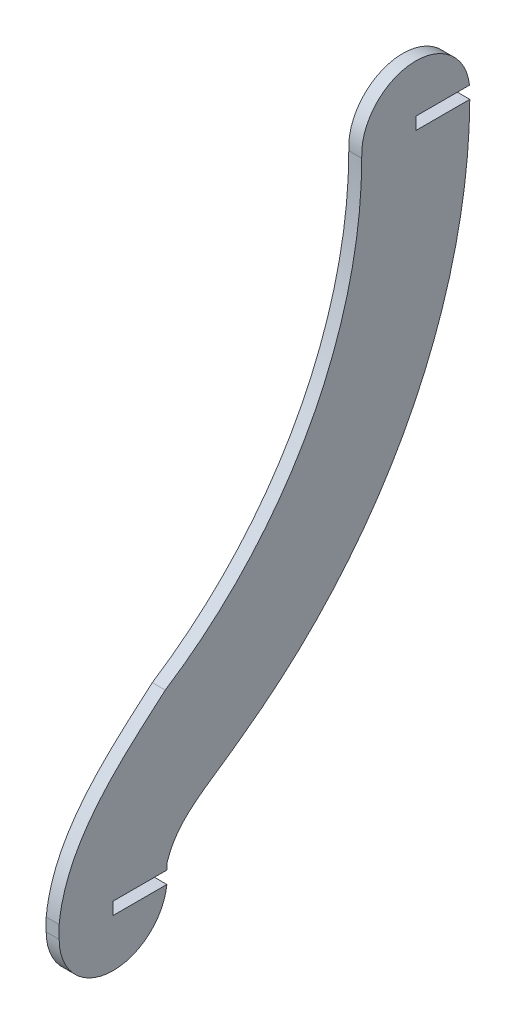
ISO-10303-21;
HEADER;
FILE_DESCRIPTION(('STEP AP214'),'2;1');
FILE_NAME('part.step','',(''),(''),'','','');
FILE_SCHEMA(('AUTOMOTIVE_DESIGN { 1 0 10303 214 1 1 1 1 }'));
ENDSEC;
DATA;
#1=APPLICATION_CONTEXT('core data for automotive mechanical design processes');
#2=APPLICATION_PROTOCOL_DEFINITION('international standard','automotive_design',2000,#1);
#3=PRODUCT_CONTEXT('',#1,'mechanical');
#4=PRODUCT('Part','Part','',(#3));
#5=PRODUCT_RELATED_PRODUCT_CATEGORY('part','',(#4));
#6=PRODUCT_DEFINITION_FORMATION('','',#4);
#7=PRODUCT_DEFINITION_CONTEXT('part definition',#1,'design');
#8=PRODUCT_DEFINITION('design','',#6,#7);
#9=PRODUCT_DEFINITION_SHAPE('','',#8);
#10=(LENGTH_UNIT() NAMED_UNIT(*) SI_UNIT(.MILLI.,.METRE.));
#11=(NAMED_UNIT(*) PLANE_ANGLE_UNIT() SI_UNIT($,.RADIAN.));
#12=(NAMED_UNIT(*) SI_UNIT($,.STERADIAN.) SOLID_ANGLE_UNIT());
#13=UNCERTAINTY_MEASURE_WITH_UNIT(LENGTH_MEASURE(1.E-05),#10,'distance_accuracy_value','');
#14=(GEOMETRIC_REPRESENTATION_CONTEXT(3) GLOBAL_UNCERTAINTY_ASSIGNED_CONTEXT((#13)) GLOBAL_UNIT_ASSIGNED_CONTEXT((#10,
#11,#12)) REPRESENTATION_CONTEXT('',''));
#15=CARTESIAN_POINT('',(0.,0.,0.));
#16=DIRECTION('',(0.,0.,1.));
#17=DIRECTION('',(1.,0.,0.));
#18=AXIS2_PLACEMENT_3D('',#15,#16,#17);
#19=CARTESIAN_POINT('',(3.,0.75,-112.5));
#20=DIRECTION('',(-1.,0.,0.));
#21=DIRECTION('',(0.,0.,1.));
#22=AXIS2_PLACEMENT_3D('',#19,#20,#21);
#23=CYLINDRICAL_SURFACE('',#22,12.5224797863682);
#24=CARTESIAN_POINT('',(3.,0.75,-112.5));
#25=DIRECTION('',(1.,0.,0.));
#26=DIRECTION('',(0.,0.,1.));
#27=AXIS2_PLACEMENT_3D('',#24,#25,#26);
#28=CIRCLE('',#27,12.5224797863682);
#29=CARTESIAN_POINT('',(3.,2.185,-124.939986937292));
#30=VERTEX_POINT('',#29);
#31=CARTESIAN_POINT('',(3.,0.,-100.));
#32=VERTEX_POINT('',#31);
#33=EDGE_CURVE('E189',#30,#32,#28,.T.);
#34=ORIENTED_EDGE('',*,*,#33,.F.);
#35=DIRECTION('',(-1.,0.,0.));
#36=VECTOR('',#35,1.);
#37=CARTESIAN_POINT('',(3.,2.185,-124.939986937292));
#38=LINE('',#37,#36);
#39=CARTESIAN_POINT('',(0.,2.185,-124.939986937292));
#40=VERTEX_POINT('',#39);
#41=EDGE_CURVE('E184',#30,#40,#38,.T.);
#42=ORIENTED_EDGE('',*,*,#41,.T.);
#43=CARTESIAN_POINT('',(0.,0.75,-112.5));
#44=DIRECTION('',(1.,0.,0.));
#45=DIRECTION('',(0.,0.,1.));
#46=AXIS2_PLACEMENT_3D('',#43,#44,#45);
#47=CIRCLE('',#46,12.5224797863682);
#48=CARTESIAN_POINT('',(0.,0.,-100.));
#49=VERTEX_POINT('',#48);
#50=EDGE_CURVE('E188',#40,#49,#47,.T.);
#51=ORIENTED_EDGE('',*,*,#50,.T.);
#52=DIRECTION('',(-1.,0.,0.));
#53=VECTOR('',#52,1.);
#54=CARTESIAN_POINT('',(3.,0.,-100.));
#55=LINE('',#54,#53);
#56=EDGE_CURVE('E40',#32,#49,#55,.T.);
#57=ORIENTED_EDGE('',*,*,#56,.F.);
#58=EDGE_LOOP('',(#34,#42,#51,#57));
#59=FACE_BOUND('',#58,.T.);
#60=ADVANCED_FACE('F33',(#59),#23,.T.);
#61=CARTESIAN_POINT('',(3.,0.,0.));
#62=DIRECTION('',(-1.,0.,0.));
#63=DIRECTION('',(0.,0.,1.));
#64=AXIS2_PLACEMENT_3D('',#61,#62,#63);
#65=CYLINDRICAL_SURFACE('',#64,100.);
#66=CARTESIAN_POINT('',(0.,0.,0.));
#67=DIRECTION('',(-1.,0.,0.));
#68=DIRECTION('',(0.,0.,1.));
#69=AXIS2_PLACEMENT_3D('',#66,#67,#68);
#70=CIRCLE('',#69,100.);
#71=CARTESIAN_POINT('',(0.,-83.8152651696344,-54.543572715251));
#72=VERTEX_POINT('',#71);
#73=EDGE_CURVE('E221',#49,#72,#70,.T.);
#74=ORIENTED_EDGE('',*,*,#73,.T.);
#75=DIRECTION('',(-1.,0.,0.));
#76=VECTOR('',#75,1.);
#77=CARTESIAN_POINT('',(3.,-83.8152651696344,-54.543572715251));
#78=LINE('',#77,#76);
#79=CARTESIAN_POINT('',(3.,-83.8152651696344,-54.543572715251));
#80=VERTEX_POINT('',#79);
#81=EDGE_CURVE('E224',#80,#72,#78,.T.);
#82=ORIENTED_EDGE('',*,*,#81,.F.);
#83=CARTESIAN_POINT('',(3.,0.,0.));
#84=DIRECTION('',(-1.,0.,0.));
#85=DIRECTION('',(0.,0.,1.));
#86=AXIS2_PLACEMENT_3D('',#83,#84,#85);
#87=CIRCLE('',#86,100.);
#88=EDGE_CURVE('E191',#32,#80,#87,.T.);
#89=ORIENTED_EDGE('',*,*,#88,.F.);
#90=ORIENTED_EDGE('',*,*,#56,.T.);
#91=EDGE_LOOP('',(#74,#82,#89,#90));
#92=FACE_BOUND('',#91,.T.);
#93=ADVANCED_FACE('F209',(#92),#65,.F.);
#94=CARTESIAN_POINT('',(3.,-83.8152651696344,-54.543572715251));
#95=CARTESIAN_POINT('',(3.,-92.6089409882353,-44.4344367811976));
#96=CARTESIAN_POINT('',(3.,-102.945692353055,-31.581333533884));
#97=CARTESIAN_POINT('',(3.,-118.5,-30.0000000000005));
#98=B_SPLINE_CURVE_WITH_KNOTS('',3,(#94,#95,#96,#97),.UNSPECIFIED.,.F.,.F.,(4,4),(0.,1.),.UNSPECIFIED.);
#99=DIRECTION('',(-1.,0.,0.));
#100=VECTOR('',#99,1.);
#101=SURFACE_OF_LINEAR_EXTRUSION('',#98,#100);
#102=CARTESIAN_POINT('',(0.,-83.8152651696344,-54.543572715251));
#103=CARTESIAN_POINT('',(0.,-92.6089409882353,-44.4344367811976));
#104=CARTESIAN_POINT('',(0.,-102.945692353055,-31.581333533884));
#105=CARTESIAN_POINT('',(0.,-118.5,-30.0000000000005));
#106=B_SPLINE_CURVE_WITH_KNOTS('',3,(#102,#103,#104,#105),.UNSPECIFIED.,.F.,.F.,(4,4),(0.,1.),.UNSPECIFIED.);
#107=CARTESIAN_POINT('',(0.,-118.5,-30.0000000000005));
#108=VERTEX_POINT('',#107);
#109=EDGE_CURVE('E228',#72,#108,#106,.T.);
#110=ORIENTED_EDGE('',*,*,#109,.T.);
#111=DIRECTION('',(-1.,0.,0.));
#112=VECTOR('',#111,1.);
#113=CARTESIAN_POINT('',(3.,-118.5,-30.0000000000005));
#114=LINE('',#113,#112);
#115=CARTESIAN_POINT('',(3.,-118.5,-30.0000000000005));
#116=VERTEX_POINT('',#115);
#117=EDGE_CURVE('E232',#116,#108,#114,.T.);
#118=ORIENTED_EDGE('',*,*,#117,.F.);
#119=EDGE_CURVE('E194',#80,#116,#98,.T.);
#120=ORIENTED_EDGE('',*,*,#119,.F.);
#121=ORIENTED_EDGE('',*,*,#81,.T.);
#122=EDGE_LOOP('',(#110,#118,#120,#121));
#123=FACE_BOUND('',#122,.T.);
#124=ADVANCED_FACE('F205',(#123),#101,.F.);
#125=CARTESIAN_POINT('',(3.,-118.5,-30.0000000000005));
#126=DIRECTION('',(0.,0.,-1.));
#127=DIRECTION('',(0.,1.,0.));
#128=AXIS2_PLACEMENT_3D('',#125,#126,#127);
#129=PLANE('',#128);
#130=DIRECTION('',(0.,-1.,0.));
#131=VECTOR('',#130,1.);
#132=CARTESIAN_POINT('',(0.,-118.5,-30.0000000000005));
#133=LINE('',#132,#131);
#134=CARTESIAN_POINT('',(0.,-121.5,-30.0000000000005));
#135=VERTEX_POINT('',#134);
#136=EDGE_CURVE('E236',#108,#135,#133,.T.);
#137=ORIENTED_EDGE('',*,*,#136,.T.);
#138=DIRECTION('',(-1.,0.,0.));
#139=VECTOR('',#138,1.);
#140=CARTESIAN_POINT('',(3.,-121.5,-30.0000000000005));
#141=LINE('',#140,#139);
#142=CARTESIAN_POINT('',(3.,-121.5,-30.0000000000005));
#143=VERTEX_POINT('',#142);
#144=EDGE_CURVE('E266',#143,#135,#141,.T.);
#145=ORIENTED_EDGE('',*,*,#144,.F.);
#146=DIRECTION('',(0.,-1.,0.));
#147=VECTOR('',#146,1.);
#148=CARTESIAN_POINT('',(3.,-118.5,-30.0000000000005));
#149=LINE('',#148,#147);
#150=EDGE_CURVE('E199',#116,#143,#149,.T.);
#151=ORIENTED_EDGE('',*,*,#150,.F.);
#152=ORIENTED_EDGE('',*,*,#117,.T.);
#153=EDGE_LOOP('',(#137,#145,#151,#152));
#154=FACE_BOUND('',#153,.T.);
#155=ADVANCED_FACE('F208',(#154),#129,.F.);
#156=CARTESIAN_POINT('',(3.,-121.5,-42.5000000000005));
#157=DIRECTION('',(-1.,0.,0.));
#158=DIRECTION('',(0.,0.,1.));
#159=AXIS2_PLACEMENT_3D('',#156,#157,#158);
#160=CYLINDRICAL_SURFACE('',#159,12.5);
#161=CARTESIAN_POINT('',(0.,-121.5,-42.5000000000005));
#162=DIRECTION('',(1.,0.,0.));
#163=DIRECTION('',(0.,0.,1.));
#164=AXIS2_PLACEMENT_3D('',#161,#162,#163);
#165=CIRCLE('',#164,12.5);
#166=CARTESIAN_POINT('',(0.,-122.935,-54.9173578107427));
#167=VERTEX_POINT('',#166);
#168=EDGE_CURVE('E238',#135,#167,#165,.T.);
#169=ORIENTED_EDGE('',*,*,#168,.T.);
#170=DIRECTION('',(-1.,0.,0.));
#171=VECTOR('',#170,1.);
#172=CARTESIAN_POINT('',(3.,-122.935,-54.9173578107427));
#173=LINE('',#172,#171);
#174=CARTESIAN_POINT('',(3.,-122.935,-54.9173578107427));
#175=VERTEX_POINT('',#174);
#176=EDGE_CURVE('E138',#167,#175,#173,.F.);
#177=ORIENTED_EDGE('',*,*,#176,.T.);
#178=CARTESIAN_POINT('',(3.,-121.5,-42.5000000000005));
#179=DIRECTION('',(1.,0.,0.));
#180=DIRECTION('',(0.,0.,1.));
#181=AXIS2_PLACEMENT_3D('',#178,#179,#180);
#182=CIRCLE('',#181,12.5);
#183=EDGE_CURVE('E275',#143,#175,#182,.T.);
#184=ORIENTED_EDGE('',*,*,#183,.F.);
#185=ORIENTED_EDGE('',*,*,#144,.T.);
#186=EDGE_LOOP('',(#169,#177,#184,#185));
#187=FACE_BOUND('',#186,.T.);
#188=ADVANCED_FACE('F298',(#187),#160,.T.);
#189=CARTESIAN_POINT('',(3.,-118.5,-55.0000000000005));
#190=DIRECTION('',(0.,0.,1.));
#191=DIRECTION('',(1.,0.,0.));
#192=AXIS2_PLACEMENT_3D('',#189,#190,#191);
#193=PLANE('',#192);
#194=DIRECTION('',(0.,1.,0.));
#195=VECTOR('',#194,1.);
#196=CARTESIAN_POINT('',(3.,-118.5,-55.0000000000005));
#197=LINE('',#196,#195);
#198=CARTESIAN_POINT('',(3.,-120.065,-55.0000000000005));
#199=VERTEX_POINT('',#198);
#200=CARTESIAN_POINT('',(3.,-118.5,-55.0000000000005));
#201=VERTEX_POINT('',#200);
#202=EDGE_CURVE('E276',#199,#201,#197,.T.);
#203=ORIENTED_EDGE('',*,*,#202,.F.);
#204=DIRECTION('',(1.,0.,0.));
#205=VECTOR('',#204,1.);
#206=CARTESIAN_POINT('',(0.,-120.065,-55.0000000000005));
#207=LINE('',#206,#205);
#208=CARTESIAN_POINT('',(0.,-120.065,-55.0000000000005));
#209=VERTEX_POINT('',#208);
#210=EDGE_CURVE('E170',#209,#199,#207,.T.);
#211=ORIENTED_EDGE('',*,*,#210,.F.);
#212=DIRECTION('',(0.,1.,0.));
#213=VECTOR('',#212,1.);
#214=CARTESIAN_POINT('',(0.,-118.5,-55.0000000000005));
#215=LINE('',#214,#213);
#216=CARTESIAN_POINT('',(0.,-118.5,-55.0000000000005));
#217=VERTEX_POINT('',#216);
#218=EDGE_CURVE('E249',#209,#217,#215,.T.);
#219=ORIENTED_EDGE('',*,*,#218,.T.);
#220=DIRECTION('',(-1.,0.,0.));
#221=VECTOR('',#220,1.);
#222=CARTESIAN_POINT('',(3.,-118.5,-55.0000000000005));
#223=LINE('',#222,#221);
#224=EDGE_CURVE('E262',#201,#217,#223,.T.);
#225=ORIENTED_EDGE('',*,*,#224,.F.);
#226=EDGE_LOOP('',(#203,#211,#219,#225));
#227=FACE_BOUND('',#226,.T.);
#228=ADVANCED_FACE('F294',(#227),#193,.F.);
#229=CARTESIAN_POINT('',(3.,-118.5,-55.0000000000005));
#230=CARTESIAN_POINT('',(3.,-110.868607185176,-57.3842878123047));
#231=CARTESIAN_POINT('',(3.,-107.86064176135,-64.5488560780221));
#232=CARTESIAN_POINT('',(3.,-101.935620664826,-72.3472821858341));
#233=B_SPLINE_CURVE_WITH_KNOTS('',3,(#229,#230,#231,#232),.UNSPECIFIED.,.F.,.F.,(4,4),(0.,1.),.UNSPECIFIED.);
#234=DIRECTION('',(-1.,0.,0.));
#235=VECTOR('',#234,1.);
#236=SURFACE_OF_LINEAR_EXTRUSION('',#233,#235);
#237=CARTESIAN_POINT('',(0.,-118.5,-55.0000000000005));
#238=CARTESIAN_POINT('',(0.,-110.868607185176,-57.3842878123047));
#239=CARTESIAN_POINT('',(0.,-107.86064176135,-64.5488560780221));
#240=CARTESIAN_POINT('',(0.,-101.935620664826,-72.3472821858341));
#241=B_SPLINE_CURVE_WITH_KNOTS('',3,(#237,#238,#239,#240),.UNSPECIFIED.,.F.,.F.,(4,4),(0.,1.),.UNSPECIFIED.);
#242=CARTESIAN_POINT('',(0.,-101.935620664826,-72.3472821858341));
#243=VERTEX_POINT('',#242);
#244=EDGE_CURVE('E251',#217,#243,#241,.T.);
#245=ORIENTED_EDGE('',*,*,#244,.T.);
#246=DIRECTION('',(-1.,0.,0.));
#247=VECTOR('',#246,1.);
#248=CARTESIAN_POINT('',(3.,-101.935620664826,-72.3472821858341));
#249=LINE('',#248,#247);
#250=CARTESIAN_POINT('',(3.,-101.935620664826,-72.3472821858341));
#251=VERTEX_POINT('',#250);
#252=EDGE_CURVE('E259',#251,#243,#249,.T.);
#253=ORIENTED_EDGE('',*,*,#252,.F.);
#254=EDGE_CURVE('E278',#201,#251,#233,.T.);
#255=ORIENTED_EDGE('',*,*,#254,.F.);
#256=ORIENTED_EDGE('',*,*,#224,.T.);
#257=EDGE_LOOP('',(#245,#253,#255,#256));
#258=FACE_BOUND('',#257,.T.);
#259=ADVANCED_FACE('F289',(#258),#236,.F.);
#260=CARTESIAN_POINT('',(3.,0.,0.));
#261=DIRECTION('',(-1.,0.,0.));
#262=DIRECTION('',(0.,0.,1.));
#263=AXIS2_PLACEMENT_3D('',#260,#261,#262);
#264=CYLINDRICAL_SURFACE('',#263,125.);
#265=CARTESIAN_POINT('',(0.,0.,0.));
#266=DIRECTION('',(1.,0.,0.));
#267=DIRECTION('',(0.,0.,1.));
#268=AXIS2_PLACEMENT_3D('',#265,#266,#267);
#269=CIRCLE('',#268,125.);
#270=CARTESIAN_POINT('',(0.,-0.685000000000001,-124.998123085909));
#271=VERTEX_POINT('',#270);
#272=EDGE_CURVE('E192',#243,#271,#269,.T.);
#273=ORIENTED_EDGE('',*,*,#272,.T.);
#274=DIRECTION('',(-1.,0.,0.));
#275=VECTOR('',#274,1.);
#276=CARTESIAN_POINT('',(3.,-0.685000000000001,-124.998123085909));
#277=LINE('',#276,#275);
#278=CARTESIAN_POINT('',(3.,-0.685000000000001,-124.998123085909));
#279=VERTEX_POINT('',#278);
#280=EDGE_CURVE('E145',#271,#279,#277,.F.);
#281=ORIENTED_EDGE('',*,*,#280,.T.);
#282=CARTESIAN_POINT('',(3.,0.,0.));
#283=DIRECTION('',(1.,0.,0.));
#284=DIRECTION('',(0.,0.,1.));
#285=AXIS2_PLACEMENT_3D('',#282,#283,#284);
#286=CIRCLE('',#285,125.);
#287=EDGE_CURVE('E263',#251,#279,#286,.T.);
#288=ORIENTED_EDGE('',*,*,#287,.F.);
#289=ORIENTED_EDGE('',*,*,#252,.T.);
#290=EDGE_LOOP('',(#273,#281,#288,#289));
#291=FACE_BOUND('',#290,.T.);
#292=ADVANCED_FACE('F293',(#291),#264,.T.);
#293=CARTESIAN_POINT('',(3.,0.75,-112.5));
#294=DIRECTION('',(-1.,0.,0.));
#295=DIRECTION('',(0.,0.,1.));
#296=AXIS2_PLACEMENT_3D('',#293,#294,#295);
#297=PLANE('',#296);
#298=ORIENTED_EDGE('',*,*,#287,.T.);
#299=DIRECTION('',(0.,0.,-1.));
#300=VECTOR('',#299,1.);
#301=CARTESIAN_POINT('',(3.,-0.685000000000001,-125.));
#302=LINE('',#301,#300);
#303=CARTESIAN_POINT('',(3.,-0.685000000000003,-112.5));
#304=VERTEX_POINT('',#303);
#305=EDGE_CURVE('E153',#304,#279,#302,.T.);
#306=ORIENTED_EDGE('',*,*,#305,.F.);
#307=DIRECTION('',(0.,-1.,0.));
#308=VECTOR('',#307,1.);
#309=CARTESIAN_POINT('',(3.,-0.685000000000003,-112.5));
#310=LINE('',#309,#308);
#311=CARTESIAN_POINT('',(3.,2.185,-112.5));
#312=VERTEX_POINT('',#311);
#313=EDGE_CURVE('E135',#312,#304,#310,.T.);
#314=ORIENTED_EDGE('',*,*,#313,.F.);
#315=DIRECTION('',(0.,0.,1.));
#316=VECTOR('',#315,1.);
#317=CARTESIAN_POINT('',(3.,2.185,-125.));
#318=LINE('',#317,#316);
#319=EDGE_CURVE('E157',#30,#312,#318,.T.);
#320=ORIENTED_EDGE('',*,*,#319,.F.);
#321=ORIENTED_EDGE('',*,*,#33,.T.);
#322=ORIENTED_EDGE('',*,*,#88,.T.);
#323=ORIENTED_EDGE('',*,*,#119,.T.);
#324=ORIENTED_EDGE('',*,*,#150,.T.);
#325=ORIENTED_EDGE('',*,*,#183,.T.);
#326=DIRECTION('',(0.,0.,-1.));
#327=VECTOR('',#326,1.);
#328=CARTESIAN_POINT('',(3.,-122.935,-55.0000000000005));
#329=LINE('',#328,#327);
#330=CARTESIAN_POINT('',(3.,-122.935,-42.5000000000005));
#331=VERTEX_POINT('',#330);
#332=EDGE_CURVE('E165',#331,#175,#329,.T.);
#333=ORIENTED_EDGE('',*,*,#332,.F.);
#334=DIRECTION('',(0.,-1.,0.));
#335=VECTOR('',#334,1.);
#336=CARTESIAN_POINT('',(3.,-120.065,-42.5000000000005));
#337=LINE('',#336,#335);
#338=CARTESIAN_POINT('',(3.,-120.065,-42.5000000000005));
#339=VERTEX_POINT('',#338);
#340=EDGE_CURVE('E174',#339,#331,#337,.T.);
#341=ORIENTED_EDGE('',*,*,#340,.F.);
#342=DIRECTION('',(0.,0.,1.));
#343=VECTOR('',#342,1.);
#344=CARTESIAN_POINT('',(3.,-120.065,-55.0000000000005));
#345=LINE('',#344,#343);
#346=EDGE_CURVE('E171',#199,#339,#345,.T.);
#347=ORIENTED_EDGE('',*,*,#346,.F.);
#348=ORIENTED_EDGE('',*,*,#202,.T.);
#349=ORIENTED_EDGE('',*,*,#254,.T.);
#350=EDGE_LOOP('',(#298,#306,#314,#320,#321,#322,#323,#324,#325,#333,#341,#347,#348,#349));
#351=FACE_BOUND('',#350,.T.);
#352=ADVANCED_FACE('F310',(#351),#297,.F.);
#353=CARTESIAN_POINT('',(0.,0.75,-112.5));
#354=DIRECTION('',(-1.,0.,0.));
#355=DIRECTION('',(0.,0.,1.));
#356=AXIS2_PLACEMENT_3D('',#353,#354,#355);
#357=PLANE('',#356);
#358=DIRECTION('',(0.,0.,-1.));
#359=VECTOR('',#358,1.);
#360=CARTESIAN_POINT('',(0.,-0.685000000000001,-125.));
#361=LINE('',#360,#359);
#362=CARTESIAN_POINT('',(0.,-0.685000000000003,-112.5));
#363=VERTEX_POINT('',#362);
#364=EDGE_CURVE('E142',#363,#271,#361,.T.);
#365=ORIENTED_EDGE('',*,*,#364,.T.);
#366=ORIENTED_EDGE('',*,*,#272,.F.);
#367=ORIENTED_EDGE('',*,*,#244,.F.);
#368=ORIENTED_EDGE('',*,*,#218,.F.);
#369=DIRECTION('',(0.,0.,1.));
#370=VECTOR('',#369,1.);
#371=CARTESIAN_POINT('',(0.,-120.065,-55.0000000000005));
#372=LINE('',#371,#370);
#373=CARTESIAN_POINT('',(0.,-120.065,-42.5000000000005));
#374=VERTEX_POINT('',#373);
#375=EDGE_CURVE('E162',#209,#374,#372,.T.);
#376=ORIENTED_EDGE('',*,*,#375,.T.);
#377=DIRECTION('',(0.,-1.,0.));
#378=VECTOR('',#377,1.);
#379=CARTESIAN_POINT('',(0.,-120.065,-42.5000000000005));
#380=LINE('',#379,#378);
#381=CARTESIAN_POINT('',(0.,-122.935,-42.5000000000005));
#382=VERTEX_POINT('',#381);
#383=EDGE_CURVE('E55',#374,#382,#380,.T.);
#384=ORIENTED_EDGE('',*,*,#383,.T.);
#385=DIRECTION('',(0.,0.,-1.));
#386=VECTOR('',#385,1.);
#387=CARTESIAN_POINT('',(0.,-122.935,-55.0000000000005));
#388=LINE('',#387,#386);
#389=EDGE_CURVE('E167',#382,#167,#388,.T.);
#390=ORIENTED_EDGE('',*,*,#389,.T.);
#391=ORIENTED_EDGE('',*,*,#168,.F.);
#392=ORIENTED_EDGE('',*,*,#136,.F.);
#393=ORIENTED_EDGE('',*,*,#109,.F.);
#394=ORIENTED_EDGE('',*,*,#73,.F.);
#395=ORIENTED_EDGE('',*,*,#50,.F.);
#396=DIRECTION('',(0.,0.,-1.));
#397=VECTOR('',#396,1.);
#398=CARTESIAN_POINT('',(0.,2.185,-112.5));
#399=LINE('',#398,#397);
#400=CARTESIAN_POINT('',(0.,2.185,-112.5));
#401=VERTEX_POINT('',#400);
#402=EDGE_CURVE('E11',#401,#40,#399,.T.);
#403=ORIENTED_EDGE('',*,*,#402,.F.);
#404=DIRECTION('',(0.,-1.,0.));
#405=VECTOR('',#404,1.);
#406=CARTESIAN_POINT('',(0.,-0.685000000000003,-112.5));
#407=LINE('',#406,#405);
#408=EDGE_CURVE('E47',#401,#363,#407,.T.);
#409=ORIENTED_EDGE('',*,*,#408,.T.);
#410=EDGE_LOOP('',(#365,#366,#367,#368,#376,#384,#390,#391,#392,#393,#394,#395,#403,#409));
#411=FACE_BOUND('',#410,.T.);
#412=ADVANCED_FACE('F151',(#411),#357,.T.);
#413=CARTESIAN_POINT('',(0.,-122.935,-55.0000000000005));
#414=DIRECTION('',(0.,-1.,0.));
#415=DIRECTION('',(0.,0.,-1.));
#416=AXIS2_PLACEMENT_3D('',#413,#414,#415);
#417=PLANE('',#416);
#418=ORIENTED_EDGE('',*,*,#389,.F.);
#419=DIRECTION('',(1.,0.,0.));
#420=VECTOR('',#419,1.);
#421=CARTESIAN_POINT('',(0.,-122.935,-42.5000000000005));
#422=LINE('',#421,#420);
#423=EDGE_CURVE('E159',#382,#331,#422,.T.);
#424=ORIENTED_EDGE('',*,*,#423,.T.);
#425=ORIENTED_EDGE('',*,*,#332,.T.);
#426=ORIENTED_EDGE('',*,*,#176,.F.);
#427=EDGE_LOOP('',(#418,#424,#425,#426));
#428=FACE_BOUND('',#427,.T.);
#429=ADVANCED_FACE('F307',(#428),#417,.F.);
#430=CARTESIAN_POINT('',(0.,-120.065,-42.5000000000005));
#431=DIRECTION('',(0.,0.,1.));
#432=DIRECTION('',(1.,0.,0.));
#433=AXIS2_PLACEMENT_3D('',#430,#431,#432);
#434=PLANE('',#433);
#435=ORIENTED_EDGE('',*,*,#340,.T.);
#436=ORIENTED_EDGE('',*,*,#423,.F.);
#437=ORIENTED_EDGE('',*,*,#383,.F.);
#438=DIRECTION('',(1.,0.,0.));
#439=VECTOR('',#438,1.);
#440=CARTESIAN_POINT('',(0.,-120.065,-42.5000000000005));
#441=LINE('',#440,#439);
#442=EDGE_CURVE('E179',#374,#339,#441,.T.);
#443=ORIENTED_EDGE('',*,*,#442,.T.);
#444=EDGE_LOOP('',(#435,#436,#437,#443));
#445=FACE_BOUND('',#444,.T.);
#446=ADVANCED_FACE('F313',(#445),#434,.F.);
#447=CARTESIAN_POINT('',(0.,-120.065,-55.0000000000005));
#448=DIRECTION('',(0.,1.,0.));
#449=DIRECTION('',(0.,0.,1.));
#450=AXIS2_PLACEMENT_3D('',#447,#448,#449);
#451=PLANE('',#450);
#452=ORIENTED_EDGE('',*,*,#346,.T.);
#453=ORIENTED_EDGE('',*,*,#442,.F.);
#454=ORIENTED_EDGE('',*,*,#375,.F.);
#455=ORIENTED_EDGE('',*,*,#210,.T.);
#456=EDGE_LOOP('',(#452,#453,#454,#455));
#457=FACE_BOUND('',#456,.T.);
#458=ADVANCED_FACE('F315',(#457),#451,.F.);
#459=CARTESIAN_POINT('',(0.,-0.685000000000001,-125.));
#460=DIRECTION('',(0.,-1.,0.));
#461=DIRECTION('',(0.,0.,-1.));
#462=AXIS2_PLACEMENT_3D('',#459,#460,#461);
#463=PLANE('',#462);
#464=ORIENTED_EDGE('',*,*,#364,.F.);
#465=DIRECTION('',(1.,0.,0.));
#466=VECTOR('',#465,1.);
#467=CARTESIAN_POINT('',(0.,-0.685000000000003,-112.5));
#468=LINE('',#467,#466);
#469=EDGE_CURVE('E131',#363,#304,#468,.T.);
#470=ORIENTED_EDGE('',*,*,#469,.T.);
#471=ORIENTED_EDGE('',*,*,#305,.T.);
#472=ORIENTED_EDGE('',*,*,#280,.F.);
#473=EDGE_LOOP('',(#464,#470,#471,#472));
#474=FACE_BOUND('',#473,.T.);
#475=ADVANCED_FACE('F143',(#474),#463,.F.);
#476=CARTESIAN_POINT('',(0.,2.185,-125.));
#477=DIRECTION('',(0.,1.,0.));
#478=DIRECTION('',(0.,0.,1.));
#479=AXIS2_PLACEMENT_3D('',#476,#477,#478);
#480=PLANE('',#479);
#481=ORIENTED_EDGE('',*,*,#319,.T.);
#482=DIRECTION('',(1.,0.,0.));
#483=VECTOR('',#482,1.);
#484=CARTESIAN_POINT('',(0.,2.185,-112.5));
#485=LINE('',#484,#483);
#486=EDGE_CURVE('E139',#401,#312,#485,.T.);
#487=ORIENTED_EDGE('',*,*,#486,.F.);
#488=ORIENTED_EDGE('',*,*,#402,.T.);
#489=ORIENTED_EDGE('',*,*,#41,.F.);
#490=EDGE_LOOP('',(#481,#487,#488,#489));
#491=FACE_BOUND('',#490,.T.);
#492=ADVANCED_FACE('F327',(#491),#480,.F.);
#493=CARTESIAN_POINT('',(0.,-0.685000000000003,-112.5));
#494=DIRECTION('',(0.,0.,1.));
#495=DIRECTION('',(1.,0.,0.));
#496=AXIS2_PLACEMENT_3D('',#493,#494,#495);
#497=PLANE('',#496);
#498=ORIENTED_EDGE('',*,*,#313,.T.);
#499=ORIENTED_EDGE('',*,*,#469,.F.);
#500=ORIENTED_EDGE('',*,*,#408,.F.);
#501=ORIENTED_EDGE('',*,*,#486,.T.);
#502=EDGE_LOOP('',(#498,#499,#500,#501));
#503=FACE_BOUND('',#502,.T.);
#504=ADVANCED_FACE('F133',(#503),#497,.F.);
#505=CLOSED_SHELL('',(#60,#93,#124,#155,#188,#228,#259,#292,#352,#412,#429,#446,#458,#475,#492,#504));
#506=MANIFOLD_SOLID_BREP('B2',#505);
#507=ADVANCED_BREP_SHAPE_REPRESENTATION('',(#18,#506),#14);
#508=SHAPE_DEFINITION_REPRESENTATION(#9,#507);
ENDSEC;
END-ISO-10303-21;
